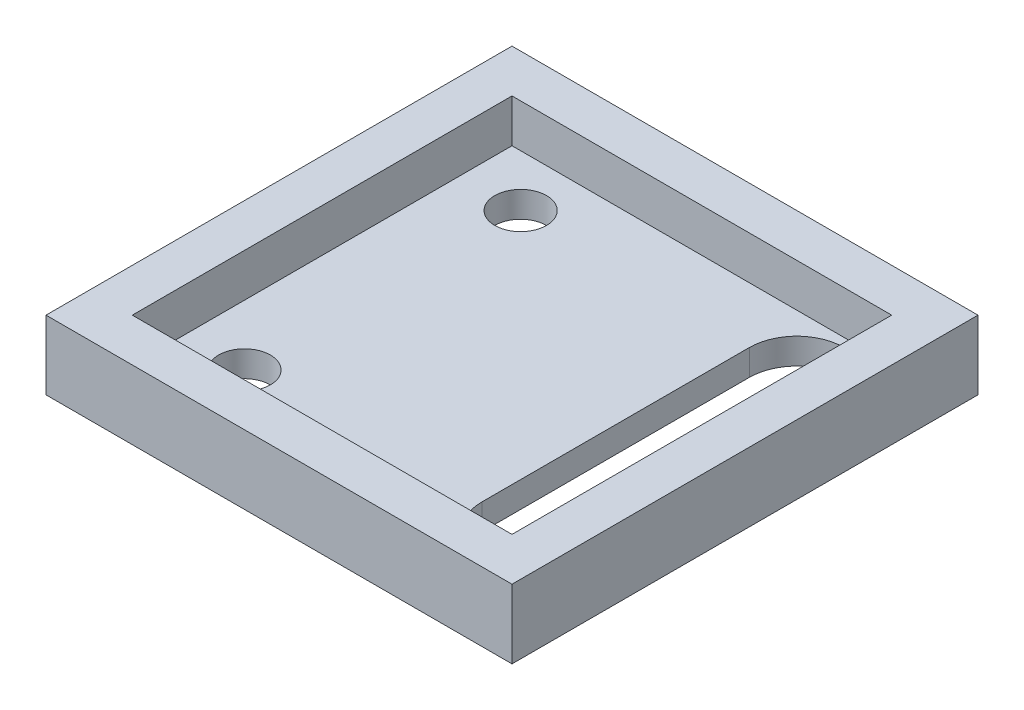
ISO-10303-21;
HEADER;
FILE_DESCRIPTION(('STEP AP214'),'2;1');
FILE_NAME('part.step','',(''),(''),'','','');
FILE_SCHEMA(('AUTOMOTIVE_DESIGN { 1 0 10303 214 1 1 1 1 }'));
ENDSEC;
DATA;
#1=APPLICATION_CONTEXT('core data for automotive mechanical design processes');
#2=APPLICATION_PROTOCOL_DEFINITION('international standard','automotive_design',2000,#1);
#3=PRODUCT_CONTEXT('',#1,'mechanical');
#4=PRODUCT('Part','Part','',(#3));
#5=PRODUCT_RELATED_PRODUCT_CATEGORY('part','',(#4));
#6=PRODUCT_DEFINITION_FORMATION('','',#4);
#7=PRODUCT_DEFINITION_CONTEXT('part definition',#1,'design');
#8=PRODUCT_DEFINITION('design','',#6,#7);
#9=PRODUCT_DEFINITION_SHAPE('','',#8);
#10=(LENGTH_UNIT() NAMED_UNIT(*) SI_UNIT(.MILLI.,.METRE.));
#11=(NAMED_UNIT(*) PLANE_ANGLE_UNIT() SI_UNIT($,.RADIAN.));
#12=(NAMED_UNIT(*) SI_UNIT($,.STERADIAN.) SOLID_ANGLE_UNIT());
#13=UNCERTAINTY_MEASURE_WITH_UNIT(LENGTH_MEASURE(1.E-05),#10,'distance_accuracy_value','');
#14=(GEOMETRIC_REPRESENTATION_CONTEXT(3) GLOBAL_UNCERTAINTY_ASSIGNED_CONTEXT((#13)) GLOBAL_UNIT_ASSIGNED_CONTEXT((#10,
#11,#12)) REPRESENTATION_CONTEXT('',''));
#15=CARTESIAN_POINT('',(0.,0.,0.));
#16=DIRECTION('',(0.,0.,1.));
#17=DIRECTION('',(1.,0.,0.));
#18=AXIS2_PLACEMENT_3D('',#15,#16,#17);
#19=CARTESIAN_POINT('',(0.,4.,-27.));
#20=DIRECTION('',(0.,0.,-1.));
#21=DIRECTION('',(-1.,0.,0.));
#22=AXIS2_PLACEMENT_3D('',#19,#20,#21);
#23=PLANE('',#22);
#24=DIRECTION('',(1.,0.,0.));
#25=VECTOR('',#24,1.);
#26=CARTESIAN_POINT('',(0.,0.,-27.));
#27=LINE('',#26,#25);
#28=CARTESIAN_POINT('',(0.,0.,-27.));
#29=VERTEX_POINT('',#28);
#30=CARTESIAN_POINT('',(27.,0.,-27.));
#31=VERTEX_POINT('',#30);
#32=EDGE_CURVE('E253',#29,#31,#27,.T.);
#33=ORIENTED_EDGE('',*,*,#32,.F.);
#34=DIRECTION('',(0.,-1.,0.));
#35=VECTOR('',#34,1.);
#36=CARTESIAN_POINT('',(0.,4.,-27.));
#37=LINE('',#36,#35);
#38=CARTESIAN_POINT('',(0.,4.,-27.));
#39=VERTEX_POINT('',#38);
#40=EDGE_CURVE('E11',#39,#29,#37,.T.);
#41=ORIENTED_EDGE('',*,*,#40,.F.);
#42=DIRECTION('',(1.,0.,0.));
#43=VECTOR('',#42,1.);
#44=CARTESIAN_POINT('',(0.,4.,-27.));
#45=LINE('',#44,#43);
#46=CARTESIAN_POINT('',(27.,4.,-27.));
#47=VERTEX_POINT('',#46);
#48=EDGE_CURVE('E263',#39,#47,#45,.T.);
#49=ORIENTED_EDGE('',*,*,#48,.T.);
#50=DIRECTION('',(0.,-1.,0.));
#51=VECTOR('',#50,1.);
#52=CARTESIAN_POINT('',(27.,4.,-27.));
#53=LINE('',#52,#51);
#54=EDGE_CURVE('E278',#47,#31,#53,.T.);
#55=ORIENTED_EDGE('',*,*,#54,.T.);
#56=EDGE_LOOP('',(#33,#41,#49,#55));
#57=FACE_BOUND('',#56,.T.);
#58=ADVANCED_FACE('F39',(#57),#23,.T.);
#59=CARTESIAN_POINT('',(0.,4.,0.));
#60=DIRECTION('',(-1.,0.,0.));
#61=DIRECTION('',(0.,0.,1.));
#62=AXIS2_PLACEMENT_3D('',#59,#60,#61);
#63=PLANE('',#62);
#64=DIRECTION('',(0.,0.,-1.));
#65=VECTOR('',#64,1.);
#66=CARTESIAN_POINT('',(0.,0.,0.));
#67=LINE('',#66,#65);
#68=CARTESIAN_POINT('',(0.,0.,0.));
#69=VERTEX_POINT('',#68);
#70=EDGE_CURVE('E268',#69,#29,#67,.T.);
#71=ORIENTED_EDGE('',*,*,#70,.F.);
#72=DIRECTION('',(0.,-1.,0.));
#73=VECTOR('',#72,1.);
#74=CARTESIAN_POINT('',(0.,4.,0.));
#75=LINE('',#74,#73);
#76=CARTESIAN_POINT('',(0.,4.,0.));
#77=VERTEX_POINT('',#76);
#78=EDGE_CURVE('E48',#77,#69,#75,.T.);
#79=ORIENTED_EDGE('',*,*,#78,.F.);
#80=DIRECTION('',(0.,0.,-1.));
#81=VECTOR('',#80,1.);
#82=CARTESIAN_POINT('',(0.,4.,0.));
#83=LINE('',#82,#81);
#84=EDGE_CURVE('E274',#77,#39,#83,.T.);
#85=ORIENTED_EDGE('',*,*,#84,.T.);
#86=ORIENTED_EDGE('',*,*,#40,.T.);
#87=EDGE_LOOP('',(#71,#79,#85,#86));
#88=FACE_BOUND('',#87,.T.);
#89=ADVANCED_FACE('F324',(#88),#63,.T.);
#90=CARTESIAN_POINT('',(0.,4.,0.));
#91=DIRECTION('',(0.,0.,-1.));
#92=DIRECTION('',(-1.,0.,0.));
#93=AXIS2_PLACEMENT_3D('',#90,#91,#92);
#94=PLANE('',#93);
#95=DIRECTION('',(1.,0.,0.));
#96=VECTOR('',#95,1.);
#97=CARTESIAN_POINT('',(0.,0.,0.));
#98=LINE('',#97,#96);
#99=CARTESIAN_POINT('',(27.,0.,0.));
#100=VERTEX_POINT('',#99);
#101=EDGE_CURVE('E286',#69,#100,#98,.T.);
#102=ORIENTED_EDGE('',*,*,#101,.T.);
#103=DIRECTION('',(0.,-1.,0.));
#104=VECTOR('',#103,1.);
#105=CARTESIAN_POINT('',(27.,4.,0.));
#106=LINE('',#105,#104);
#107=CARTESIAN_POINT('',(27.,4.,0.));
#108=VERTEX_POINT('',#107);
#109=EDGE_CURVE('E294',#108,#100,#106,.T.);
#110=ORIENTED_EDGE('',*,*,#109,.F.);
#111=DIRECTION('',(1.,0.,0.));
#112=VECTOR('',#111,1.);
#113=CARTESIAN_POINT('',(0.,4.,0.));
#114=LINE('',#113,#112);
#115=EDGE_CURVE('E271',#77,#108,#114,.T.);
#116=ORIENTED_EDGE('',*,*,#115,.F.);
#117=ORIENTED_EDGE('',*,*,#78,.T.);
#118=EDGE_LOOP('',(#102,#110,#116,#117));
#119=FACE_BOUND('',#118,.T.);
#120=ADVANCED_FACE('F329',(#119),#94,.F.);
#121=CARTESIAN_POINT('',(27.,4.,0.));
#122=DIRECTION('',(-1.,0.,0.));
#123=DIRECTION('',(0.,0.,1.));
#124=AXIS2_PLACEMENT_3D('',#121,#122,#123);
#125=PLANE('',#124);
#126=DIRECTION('',(0.,0.,-1.));
#127=VECTOR('',#126,1.);
#128=CARTESIAN_POINT('',(27.,0.,0.));
#129=LINE('',#128,#127);
#130=EDGE_CURVE('E282',#100,#31,#129,.T.);
#131=ORIENTED_EDGE('',*,*,#130,.T.);
#132=ORIENTED_EDGE('',*,*,#54,.F.);
#133=DIRECTION('',(0.,0.,-1.));
#134=VECTOR('',#133,1.);
#135=CARTESIAN_POINT('',(27.,4.,0.));
#136=LINE('',#135,#134);
#137=EDGE_CURVE('E267',#108,#47,#136,.T.);
#138=ORIENTED_EDGE('',*,*,#137,.F.);
#139=ORIENTED_EDGE('',*,*,#109,.T.);
#140=EDGE_LOOP('',(#131,#132,#138,#139));
#141=FACE_BOUND('',#140,.T.);
#142=ADVANCED_FACE('F347',(#141),#125,.F.);
#143=CARTESIAN_POINT('',(0.,4.,0.));
#144=DIRECTION('',(0.,1.,0.));
#145=DIRECTION('',(0.,0.,1.));
#146=AXIS2_PLACEMENT_3D('',#143,#144,#145);
#147=PLANE('',#146);
#148=DIRECTION('',(0.,0.,-1.));
#149=VECTOR('',#148,1.);
#150=CARTESIAN_POINT('',(24.5,4.,-24.5));
#151=LINE('',#150,#149);
#152=CARTESIAN_POINT('',(24.5,4.,-2.5));
#153=VERTEX_POINT('',#152);
#154=CARTESIAN_POINT('',(24.5,4.,-24.5));
#155=VERTEX_POINT('',#154);
#156=EDGE_CURVE('E235',#153,#155,#151,.T.);
#157=ORIENTED_EDGE('',*,*,#156,.F.);
#158=DIRECTION('',(1.,0.,0.));
#159=VECTOR('',#158,1.);
#160=CARTESIAN_POINT('',(2.50000000000001,4.,-2.5));
#161=LINE('',#160,#159);
#162=CARTESIAN_POINT('',(2.50000000000001,4.,-2.5));
#163=VERTEX_POINT('',#162);
#164=EDGE_CURVE('E246',#163,#153,#161,.T.);
#165=ORIENTED_EDGE('',*,*,#164,.F.);
#166=DIRECTION('',(0.,0.,1.));
#167=VECTOR('',#166,1.);
#168=CARTESIAN_POINT('',(2.50000000000001,4.,-24.5));
#169=LINE('',#168,#167);
#170=CARTESIAN_POINT('',(2.50000000000001,4.,-24.5));
#171=VERTEX_POINT('',#170);
#172=EDGE_CURVE('E242',#171,#163,#169,.T.);
#173=ORIENTED_EDGE('',*,*,#172,.F.);
#174=DIRECTION('',(-1.,0.,0.));
#175=VECTOR('',#174,1.);
#176=CARTESIAN_POINT('',(2.50000000000001,4.,-24.5));
#177=LINE('',#176,#175);
#178=EDGE_CURVE('E238',#155,#171,#177,.T.);
#179=ORIENTED_EDGE('',*,*,#178,.F.);
#180=EDGE_LOOP('',(#157,#165,#173,#179));
#181=FACE_BOUND('',#180,.T.);
#182=ORIENTED_EDGE('',*,*,#48,.F.);
#183=ORIENTED_EDGE('',*,*,#84,.F.);
#184=ORIENTED_EDGE('',*,*,#115,.T.);
#185=ORIENTED_EDGE('',*,*,#137,.T.);
#186=EDGE_LOOP('',(#182,#183,#184,#185));
#187=FACE_BOUND('',#186,.T.);
#188=ADVANCED_FACE('F343',(#181,#187),#147,.T.);
#189=CARTESIAN_POINT('',(0.,0.,0.));
#190=DIRECTION('',(0.,1.,0.));
#191=DIRECTION('',(0.,0.,1.));
#192=AXIS2_PLACEMENT_3D('',#189,#190,#191);
#193=PLANE('',#192);
#194=DIRECTION('',(0.,0.,-1.));
#195=VECTOR('',#194,1.);
#196=CARTESIAN_POINT('',(24.5,0.,0.));
#197=LINE('',#196,#195);
#198=CARTESIAN_POINT('',(24.5,0.,-5.75));
#199=VERTEX_POINT('',#198);
#200=CARTESIAN_POINT('',(24.5,0.,-21.25));
#201=VERTEX_POINT('',#200);
#202=EDGE_CURVE('E200',#199,#201,#197,.T.);
#203=ORIENTED_EDGE('',*,*,#202,.T.);
#204=CARTESIAN_POINT('',(21.6944444444445,0.,-21.25));
#205=DIRECTION('',(0.,1.,0.));
#206=DIRECTION('',(0.,0.,1.));
#207=AXIS2_PLACEMENT_3D('',#204,#205,#206);
#208=CIRCLE('',#207,2.80555555555555);
#209=CARTESIAN_POINT('',(22.25,0.,-24.));
#210=VERTEX_POINT('',#209);
#211=EDGE_CURVE('E204',#201,#210,#208,.T.);
#212=ORIENTED_EDGE('',*,*,#211,.T.);
#213=CARTESIAN_POINT('',(22.25,0.,-21.25));
#214=DIRECTION('',(0.,1.,0.));
#215=DIRECTION('',(0.,0.,1.));
#216=AXIS2_PLACEMENT_3D('',#213,#214,#215);
#217=CIRCLE('',#216,2.75);
#218=CARTESIAN_POINT('',(19.5,0.,-21.25));
#219=VERTEX_POINT('',#218);
#220=EDGE_CURVE('E177',#210,#219,#217,.T.);
#221=ORIENTED_EDGE('',*,*,#220,.T.);
#222=DIRECTION('',(0.,0.,1.));
#223=VECTOR('',#222,1.);
#224=CARTESIAN_POINT('',(19.5,0.,0.));
#225=LINE('',#224,#223);
#226=CARTESIAN_POINT('',(19.5,0.,-5.74999999999999));
#227=VERTEX_POINT('',#226);
#228=EDGE_CURVE('E147',#219,#227,#225,.T.);
#229=ORIENTED_EDGE('',*,*,#228,.T.);
#230=CARTESIAN_POINT('',(22.25,0.,-5.74999999999999));
#231=DIRECTION('',(0.,1.,0.));
#232=DIRECTION('',(0.,0.,1.));
#233=AXIS2_PLACEMENT_3D('',#230,#231,#232);
#234=CIRCLE('',#233,2.75);
#235=CARTESIAN_POINT('',(22.25,0.,-3.));
#236=VERTEX_POINT('',#235);
#237=EDGE_CURVE('E192',#227,#236,#234,.T.);
#238=ORIENTED_EDGE('',*,*,#237,.T.);
#239=CARTESIAN_POINT('',(21.6944444444445,0.,-5.74999999999999));
#240=DIRECTION('',(0.,1.,0.));
#241=DIRECTION('',(0.,0.,1.));
#242=AXIS2_PLACEMENT_3D('',#239,#240,#241);
#243=CIRCLE('',#242,2.80555555555555);
#244=EDGE_CURVE('E196',#236,#199,#243,.T.);
#245=ORIENTED_EDGE('',*,*,#244,.T.);
#246=EDGE_LOOP('',(#203,#212,#221,#229,#238,#245));
#247=FACE_BOUND('',#246,.T.);
#248=CARTESIAN_POINT('',(6.,0.,-21.5));
#249=DIRECTION('',(0.,-1.,0.));
#250=DIRECTION('',(0.,0.,-1.));
#251=AXIS2_PLACEMENT_3D('',#248,#249,#250);
#252=CIRCLE('',#251,1.5);
#253=CARTESIAN_POINT('',(6.,0.,-23.));
#254=VERTEX_POINT('',#253);
#255=EDGE_CURVE('E209',#254,#254,#252,.T.);
#256=ORIENTED_EDGE('',*,*,#255,.F.);
#257=EDGE_LOOP('',(#256));
#258=FACE_BOUND('',#257,.T.);
#259=CARTESIAN_POINT('',(6.,0.,-5.5));
#260=DIRECTION('',(0.,-1.,0.));
#261=DIRECTION('',(0.,0.,-1.));
#262=AXIS2_PLACEMENT_3D('',#259,#260,#261);
#263=CIRCLE('',#262,1.5);
#264=CARTESIAN_POINT('',(6.,0.,-7.));
#265=VERTEX_POINT('',#264);
#266=EDGE_CURVE('E208',#265,#265,#263,.T.);
#267=ORIENTED_EDGE('',*,*,#266,.F.);
#268=EDGE_LOOP('',(#267));
#269=FACE_BOUND('',#268,.T.);
#270=ORIENTED_EDGE('',*,*,#32,.T.);
#271=ORIENTED_EDGE('',*,*,#130,.F.);
#272=ORIENTED_EDGE('',*,*,#101,.F.);
#273=ORIENTED_EDGE('',*,*,#70,.T.);
#274=EDGE_LOOP('',(#270,#271,#272,#273));
#275=FACE_BOUND('',#274,.T.);
#276=ADVANCED_FACE('F339',(#247,#258,#269,#275),#193,.F.);
#277=CARTESIAN_POINT('',(24.5,1.5,-24.5));
#278=DIRECTION('',(1.,0.,0.));
#279=DIRECTION('',(0.,0.,-1.));
#280=AXIS2_PLACEMENT_3D('',#277,#278,#279);
#281=PLANE('',#280);
#282=ORIENTED_EDGE('',*,*,#156,.T.);
#283=DIRECTION('',(0.,1.,0.));
#284=VECTOR('',#283,1.);
#285=CARTESIAN_POINT('',(24.5,1.5,-24.5));
#286=LINE('',#285,#284);
#287=CARTESIAN_POINT('',(24.5,1.5,-24.5));
#288=VERTEX_POINT('',#287);
#289=EDGE_CURVE('E234',#288,#155,#286,.T.);
#290=ORIENTED_EDGE('',*,*,#289,.F.);
#291=DIRECTION('',(0.,0.,-1.));
#292=VECTOR('',#291,1.);
#293=CARTESIAN_POINT('',(24.5,1.5,-24.5));
#294=LINE('',#293,#292);
#295=CARTESIAN_POINT('',(24.5,1.5,-21.25));
#296=VERTEX_POINT('',#295);
#297=EDGE_CURVE('E222',#296,#288,#294,.T.);
#298=ORIENTED_EDGE('',*,*,#297,.F.);
#299=DIRECTION('',(0.,1.,0.));
#300=VECTOR('',#299,1.);
#301=CARTESIAN_POINT('',(24.5,-8.5,-21.25));
#302=LINE('',#301,#300);
#303=EDGE_CURVE('E174',#201,#296,#302,.T.);
#304=ORIENTED_EDGE('',*,*,#303,.F.);
#305=ORIENTED_EDGE('',*,*,#202,.F.);
#306=DIRECTION('',(0.,1.,0.));
#307=VECTOR('',#306,1.);
#308=CARTESIAN_POINT('',(24.5,-8.5,-5.75));
#309=LINE('',#308,#307);
#310=CARTESIAN_POINT('',(24.5,1.5,-5.75));
#311=VERTEX_POINT('',#310);
#312=EDGE_CURVE('E178',#199,#311,#309,.T.);
#313=ORIENTED_EDGE('',*,*,#312,.T.);
#314=CARTESIAN_POINT('',(24.5,1.5,-2.5));
#315=VERTEX_POINT('',#314);
#316=EDGE_CURVE('E217',#315,#311,#294,.T.);
#317=ORIENTED_EDGE('',*,*,#316,.F.);
#318=DIRECTION('',(0.,1.,0.));
#319=VECTOR('',#318,1.);
#320=CARTESIAN_POINT('',(24.5,1.5,-2.5));
#321=LINE('',#320,#319);
#322=EDGE_CURVE('E250',#315,#153,#321,.T.);
#323=ORIENTED_EDGE('',*,*,#322,.T.);
#324=EDGE_LOOP('',(#282,#290,#298,#304,#305,#313,#317,#323));
#325=FACE_BOUND('',#324,.T.);
#326=ADVANCED_FACE('F357',(#325),#281,.F.);
#327=CARTESIAN_POINT('',(2.50000000000001,1.5,-2.5));
#328=DIRECTION('',(0.,0.,1.));
#329=DIRECTION('',(1.,0.,0.));
#330=AXIS2_PLACEMENT_3D('',#327,#328,#329);
#331=PLANE('',#330);
#332=ORIENTED_EDGE('',*,*,#164,.T.);
#333=ORIENTED_EDGE('',*,*,#322,.F.);
#334=DIRECTION('',(1.,0.,0.));
#335=VECTOR('',#334,1.);
#336=CARTESIAN_POINT('',(2.50000000000001,1.5,-2.5));
#337=LINE('',#336,#335);
#338=CARTESIAN_POINT('',(2.50000000000001,1.5,-2.5));
#339=VERTEX_POINT('',#338);
#340=EDGE_CURVE('E230',#339,#315,#337,.T.);
#341=ORIENTED_EDGE('',*,*,#340,.F.);
#342=DIRECTION('',(0.,1.,0.));
#343=VECTOR('',#342,1.);
#344=CARTESIAN_POINT('',(2.50000000000001,1.5,-2.5));
#345=LINE('',#344,#343);
#346=EDGE_CURVE('E254',#339,#163,#345,.T.);
#347=ORIENTED_EDGE('',*,*,#346,.T.);
#348=EDGE_LOOP('',(#332,#333,#341,#347));
#349=FACE_BOUND('',#348,.T.);
#350=ADVANCED_FACE('F363',(#349),#331,.F.);
#351=CARTESIAN_POINT('',(2.50000000000001,1.5,-24.5));
#352=DIRECTION('',(-1.,0.,0.));
#353=DIRECTION('',(0.,0.,1.));
#354=AXIS2_PLACEMENT_3D('',#351,#352,#353);
#355=PLANE('',#354);
#356=ORIENTED_EDGE('',*,*,#172,.T.);
#357=ORIENTED_EDGE('',*,*,#346,.F.);
#358=DIRECTION('',(0.,0.,1.));
#359=VECTOR('',#358,1.);
#360=CARTESIAN_POINT('',(2.50000000000001,1.5,-24.5));
#361=LINE('',#360,#359);
#362=CARTESIAN_POINT('',(2.50000000000001,1.5,-24.5));
#363=VERTEX_POINT('',#362);
#364=EDGE_CURVE('E226',#363,#339,#361,.T.);
#365=ORIENTED_EDGE('',*,*,#364,.F.);
#366=DIRECTION('',(0.,1.,0.));
#367=VECTOR('',#366,1.);
#368=CARTESIAN_POINT('',(2.50000000000001,1.5,-24.5));
#369=LINE('',#368,#367);
#370=EDGE_CURVE('E257',#363,#171,#369,.T.);
#371=ORIENTED_EDGE('',*,*,#370,.T.);
#372=EDGE_LOOP('',(#356,#357,#365,#371));
#373=FACE_BOUND('',#372,.T.);
#374=ADVANCED_FACE('F319',(#373),#355,.F.);
#375=CARTESIAN_POINT('',(2.50000000000001,1.5,-24.5));
#376=DIRECTION('',(0.,0.,-1.));
#377=DIRECTION('',(-1.,0.,0.));
#378=AXIS2_PLACEMENT_3D('',#375,#376,#377);
#379=PLANE('',#378);
#380=ORIENTED_EDGE('',*,*,#178,.T.);
#381=ORIENTED_EDGE('',*,*,#370,.F.);
#382=DIRECTION('',(-1.,0.,0.));
#383=VECTOR('',#382,1.);
#384=CARTESIAN_POINT('',(2.50000000000001,1.5,-24.5));
#385=LINE('',#384,#383);
#386=EDGE_CURVE('E221',#288,#363,#385,.T.);
#387=ORIENTED_EDGE('',*,*,#386,.F.);
#388=ORIENTED_EDGE('',*,*,#289,.T.);
#389=EDGE_LOOP('',(#380,#381,#387,#388));
#390=FACE_BOUND('',#389,.T.);
#391=ADVANCED_FACE('F312',(#390),#379,.F.);
#392=CARTESIAN_POINT('',(0.,1.5,0.));
#393=DIRECTION('',(0.,1.,0.));
#394=DIRECTION('',(0.,0.,1.));
#395=AXIS2_PLACEMENT_3D('',#392,#393,#394);
#396=PLANE('',#395);
#397=CARTESIAN_POINT('',(21.6944444444445,1.5,-21.25));
#398=DIRECTION('',(0.,1.,0.));
#399=DIRECTION('',(0.,0.,1.));
#400=AXIS2_PLACEMENT_3D('',#397,#398,#399);
#401=CIRCLE('',#400,2.80555555555555);
#402=CARTESIAN_POINT('',(22.25,1.5,-24.));
#403=VERTEX_POINT('',#402);
#404=EDGE_CURVE('E64',#296,#403,#401,.T.);
#405=ORIENTED_EDGE('',*,*,#404,.F.);
#406=ORIENTED_EDGE('',*,*,#297,.T.);
#407=ORIENTED_EDGE('',*,*,#386,.T.);
#408=ORIENTED_EDGE('',*,*,#364,.T.);
#409=ORIENTED_EDGE('',*,*,#340,.T.);
#410=ORIENTED_EDGE('',*,*,#316,.T.);
#411=CARTESIAN_POINT('',(21.6944444444445,1.5,-5.74999999999999));
#412=DIRECTION('',(0.,1.,0.));
#413=DIRECTION('',(0.,0.,1.));
#414=AXIS2_PLACEMENT_3D('',#411,#412,#413);
#415=CIRCLE('',#414,2.80555555555555);
#416=CARTESIAN_POINT('',(22.25,1.5,-3.));
#417=VERTEX_POINT('',#416);
#418=EDGE_CURVE('E167',#417,#311,#415,.T.);
#419=ORIENTED_EDGE('',*,*,#418,.F.);
#420=CARTESIAN_POINT('',(22.25,1.5,-5.74999999999999));
#421=DIRECTION('',(0.,1.,0.));
#422=DIRECTION('',(0.,0.,1.));
#423=AXIS2_PLACEMENT_3D('',#420,#421,#422);
#424=CIRCLE('',#423,2.75);
#425=CARTESIAN_POINT('',(19.5,1.5,-5.74999999999999));
#426=VERTEX_POINT('',#425);
#427=EDGE_CURVE('E163',#426,#417,#424,.T.);
#428=ORIENTED_EDGE('',*,*,#427,.F.);
#429=DIRECTION('',(0.,0.,1.));
#430=VECTOR('',#429,1.);
#431=CARTESIAN_POINT('',(19.5,1.5,0.));
#432=LINE('',#431,#430);
#433=CARTESIAN_POINT('',(19.5,1.5,-21.25));
#434=VERTEX_POINT('',#433);
#435=EDGE_CURVE('E144',#434,#426,#432,.T.);
#436=ORIENTED_EDGE('',*,*,#435,.F.);
#437=CARTESIAN_POINT('',(22.25,1.5,-21.25));
#438=DIRECTION('',(0.,1.,0.));
#439=DIRECTION('',(0.,0.,1.));
#440=AXIS2_PLACEMENT_3D('',#437,#438,#439);
#441=CIRCLE('',#440,2.75);
#442=EDGE_CURVE('E154',#403,#434,#441,.T.);
#443=ORIENTED_EDGE('',*,*,#442,.F.);
#444=EDGE_LOOP('',(#405,#406,#407,#408,#409,#410,#419,#428,#436,#443));
#445=FACE_BOUND('',#444,.T.);
#446=CARTESIAN_POINT('',(6.,1.5,-21.5));
#447=DIRECTION('',(0.,1.,0.));
#448=DIRECTION('',(0.,0.,1.));
#449=AXIS2_PLACEMENT_3D('',#446,#447,#448);
#450=CIRCLE('',#449,1.5);
#451=CARTESIAN_POINT('',(6.,1.5,-20.));
#452=VERTEX_POINT('',#451);
#453=EDGE_CURVE('E42',#452,#452,#450,.T.);
#454=ORIENTED_EDGE('',*,*,#453,.F.);
#455=EDGE_LOOP('',(#454));
#456=FACE_BOUND('',#455,.T.);
#457=CARTESIAN_POINT('',(6.,1.5,-5.5));
#458=DIRECTION('',(0.,1.,0.));
#459=DIRECTION('',(0.,0.,1.));
#460=AXIS2_PLACEMENT_3D('',#457,#458,#459);
#461=CIRCLE('',#460,1.5);
#462=CARTESIAN_POINT('',(6.,1.5,-4.));
#463=VERTEX_POINT('',#462);
#464=EDGE_CURVE('E213',#463,#463,#461,.T.);
#465=ORIENTED_EDGE('',*,*,#464,.F.);
#466=EDGE_LOOP('',(#465));
#467=FACE_BOUND('',#466,.T.);
#468=ADVANCED_FACE('F159',(#445,#456,#467),#396,.T.);
#469=CARTESIAN_POINT('',(6.,10.,-5.5));
#470=DIRECTION('',(0.,-1.,0.));
#471=DIRECTION('',(0.,0.,-1.));
#472=AXIS2_PLACEMENT_3D('',#469,#470,#471);
#473=CYLINDRICAL_SURFACE('',#472,1.5);
#474=ORIENTED_EDGE('',*,*,#464,.T.);
#475=EDGE_LOOP('',(#474));
#476=FACE_BOUND('',#475,.T.);
#477=ORIENTED_EDGE('',*,*,#266,.T.);
#478=EDGE_LOOP('',(#477));
#479=FACE_BOUND('',#478,.T.);
#480=ADVANCED_FACE('F311',(#476,#479),#473,.F.);
#481=CARTESIAN_POINT('',(6.,10.,-21.5));
#482=DIRECTION('',(0.,-1.,0.));
#483=DIRECTION('',(0.,0.,-1.));
#484=AXIS2_PLACEMENT_3D('',#481,#482,#483);
#485=CYLINDRICAL_SURFACE('',#484,1.5);
#486=ORIENTED_EDGE('',*,*,#453,.T.);
#487=EDGE_LOOP('',(#486));
#488=FACE_BOUND('',#487,.T.);
#489=ORIENTED_EDGE('',*,*,#255,.T.);
#490=EDGE_LOOP('',(#489));
#491=FACE_BOUND('',#490,.T.);
#492=ADVANCED_FACE('F307',(#488,#491),#485,.F.);
#493=CARTESIAN_POINT('',(21.6944444444445,-8.5,-21.25));
#494=DIRECTION('',(0.,1.,0.));
#495=DIRECTION('',(0.,0.,1.));
#496=AXIS2_PLACEMENT_3D('',#493,#494,#495);
#497=CYLINDRICAL_SURFACE('',#496,2.80555555555555);
#498=ORIENTED_EDGE('',*,*,#303,.T.);
#499=ORIENTED_EDGE('',*,*,#404,.T.);
#500=DIRECTION('',(0.,1.,0.));
#501=VECTOR('',#500,1.);
#502=CARTESIAN_POINT('',(22.25,-8.5,-24.));
#503=LINE('',#502,#501);
#504=EDGE_CURVE('E151',#210,#403,#503,.T.);
#505=ORIENTED_EDGE('',*,*,#504,.F.);
#506=ORIENTED_EDGE('',*,*,#211,.F.);
#507=EDGE_LOOP('',(#498,#499,#505,#506));
#508=FACE_BOUND('',#507,.T.);
#509=ADVANCED_FACE('F391',(#508),#497,.F.);
#510=CARTESIAN_POINT('',(21.6944444444445,-8.5,-5.74999999999999));
#511=DIRECTION('',(0.,1.,0.));
#512=DIRECTION('',(0.,0.,1.));
#513=AXIS2_PLACEMENT_3D('',#510,#511,#512);
#514=CYLINDRICAL_SURFACE('',#513,2.80555555555555);
#515=DIRECTION('',(0.,1.,0.));
#516=VECTOR('',#515,1.);
#517=CARTESIAN_POINT('',(22.25,-8.5,-3.));
#518=LINE('',#517,#516);
#519=EDGE_CURVE('E181',#236,#417,#518,.T.);
#520=ORIENTED_EDGE('',*,*,#519,.T.);
#521=ORIENTED_EDGE('',*,*,#418,.T.);
#522=ORIENTED_EDGE('',*,*,#312,.F.);
#523=ORIENTED_EDGE('',*,*,#244,.F.);
#524=EDGE_LOOP('',(#520,#521,#522,#523));
#525=FACE_BOUND('',#524,.T.);
#526=ADVANCED_FACE('F388',(#525),#514,.F.);
#527=CARTESIAN_POINT('',(22.25,-8.5,-5.74999999999999));
#528=DIRECTION('',(0.,1.,0.));
#529=DIRECTION('',(0.,0.,1.));
#530=AXIS2_PLACEMENT_3D('',#527,#528,#529);
#531=CYLINDRICAL_SURFACE('',#530,2.75);
#532=DIRECTION('',(0.,1.,0.));
#533=VECTOR('',#532,1.);
#534=CARTESIAN_POINT('',(19.5,-8.5,-5.74999999999999));
#535=LINE('',#534,#533);
#536=EDGE_CURVE('E150',#227,#426,#535,.T.);
#537=ORIENTED_EDGE('',*,*,#536,.T.);
#538=ORIENTED_EDGE('',*,*,#427,.T.);
#539=ORIENTED_EDGE('',*,*,#519,.F.);
#540=ORIENTED_EDGE('',*,*,#237,.F.);
#541=EDGE_LOOP('',(#537,#538,#539,#540));
#542=FACE_BOUND('',#541,.T.);
#543=ADVANCED_FACE('F390',(#542),#531,.F.);
#544=CARTESIAN_POINT('',(19.5,-8.5,0.));
#545=DIRECTION('',(-1.,0.,0.));
#546=DIRECTION('',(0.,0.,1.));
#547=AXIS2_PLACEMENT_3D('',#544,#545,#546);
#548=PLANE('',#547);
#549=DIRECTION('',(0.,1.,0.));
#550=VECTOR('',#549,1.);
#551=CARTESIAN_POINT('',(19.5,-8.5,-21.25));
#552=LINE('',#551,#550);
#553=EDGE_CURVE('E56',#219,#434,#552,.T.);
#554=ORIENTED_EDGE('',*,*,#553,.T.);
#555=ORIENTED_EDGE('',*,*,#435,.T.);
#556=ORIENTED_EDGE('',*,*,#536,.F.);
#557=ORIENTED_EDGE('',*,*,#228,.F.);
#558=EDGE_LOOP('',(#554,#555,#556,#557));
#559=FACE_BOUND('',#558,.T.);
#560=ADVANCED_FACE('F141',(#559),#548,.F.);
#561=CARTESIAN_POINT('',(22.25,-8.5,-21.25));
#562=DIRECTION('',(0.,1.,0.));
#563=DIRECTION('',(0.,0.,1.));
#564=AXIS2_PLACEMENT_3D('',#561,#562,#563);
#565=CYLINDRICAL_SURFACE('',#564,2.75);
#566=ORIENTED_EDGE('',*,*,#504,.T.);
#567=ORIENTED_EDGE('',*,*,#442,.T.);
#568=ORIENTED_EDGE('',*,*,#553,.F.);
#569=ORIENTED_EDGE('',*,*,#220,.F.);
#570=EDGE_LOOP('',(#566,#567,#568,#569));
#571=FACE_BOUND('',#570,.T.);
#572=ADVANCED_FACE('F155',(#571),#565,.F.);
#573=CLOSED_SHELL('',(#58,#89,#120,#142,#188,#276,#326,#350,#374,#391,#468,#480,#492,#509,#526,
#543,#560,#572));
#574=MANIFOLD_SOLID_BREP('B2',#573);
#575=ADVANCED_BREP_SHAPE_REPRESENTATION('',(#18,#574),#14);
#576=SHAPE_DEFINITION_REPRESENTATION(#9,#575);
ENDSEC;
END-ISO-10303-21;
